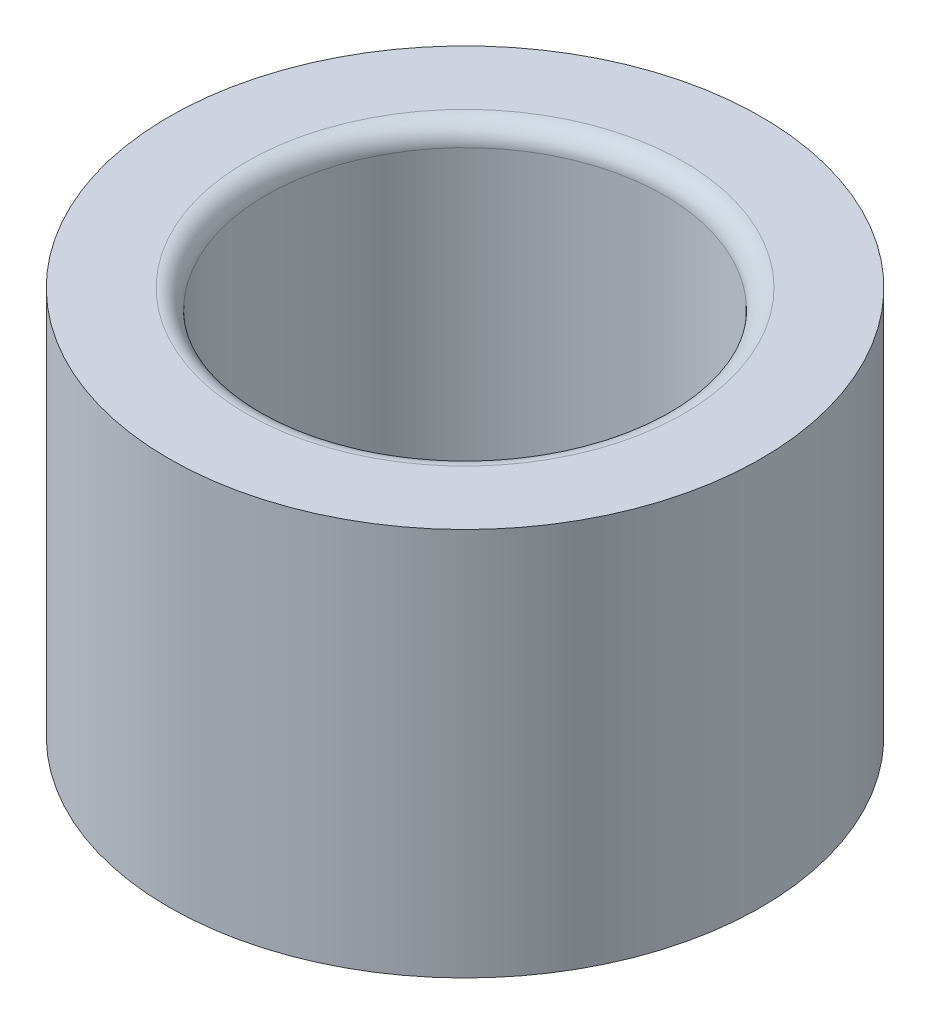
ISO-10303-21;
HEADER;
FILE_DESCRIPTION(('STEP AP214'),'2;1');
FILE_NAME('part.step','',(''),(''),'','','');
FILE_SCHEMA(('AUTOMOTIVE_DESIGN { 1 0 10303 214 1 1 1 1 }'));
ENDSEC;
DATA;
#1=APPLICATION_CONTEXT('core data for automotive mechanical design processes');
#2=APPLICATION_PROTOCOL_DEFINITION('international standard','automotive_design',2000,#1);
#3=PRODUCT_CONTEXT('',#1,'mechanical');
#4=PRODUCT('Part','Part','',(#3));
#5=PRODUCT_RELATED_PRODUCT_CATEGORY('part','',(#4));
#6=PRODUCT_DEFINITION_FORMATION('','',#4);
#7=PRODUCT_DEFINITION_CONTEXT('part definition',#1,'design');
#8=PRODUCT_DEFINITION('design','',#6,#7);
#9=PRODUCT_DEFINITION_SHAPE('','',#8);
#10=(LENGTH_UNIT() NAMED_UNIT(*) SI_UNIT(.MILLI.,.METRE.));
#11=(NAMED_UNIT(*) PLANE_ANGLE_UNIT() SI_UNIT($,.RADIAN.));
#12=(NAMED_UNIT(*) SI_UNIT($,.STERADIAN.) SOLID_ANGLE_UNIT());
#13=UNCERTAINTY_MEASURE_WITH_UNIT(LENGTH_MEASURE(1.E-05),#10,'distance_accuracy_value','');
#14=(GEOMETRIC_REPRESENTATION_CONTEXT(3) GLOBAL_UNCERTAINTY_ASSIGNED_CONTEXT((#13)) GLOBAL_UNIT_ASSIGNED_CONTEXT((#10,
#11,#12)) REPRESENTATION_CONTEXT('',''));
#15=CARTESIAN_POINT('',(0.,0.,0.));
#16=DIRECTION('',(0.,0.,1.));
#17=DIRECTION('',(1.,0.,0.));
#18=AXIS2_PLACEMENT_3D('',#15,#16,#17);
#19=CARTESIAN_POINT('',(0.,20.,0.));
#20=DIRECTION('',(0.,1.,0.));
#21=DIRECTION('',(0.,0.,1.));
#22=AXIS2_PLACEMENT_3D('',#19,#20,#21);
#23=PLANE('',#22);
#24=CARTESIAN_POINT('',(0.,20.,0.));
#25=DIRECTION('',(0.,1.,0.));
#26=DIRECTION('',(0.,0.,1.));
#27=AXIS2_PLACEMENT_3D('',#24,#25,#26);
#28=CIRCLE('',#27,11.25);
#29=CARTESIAN_POINT('',(0.,20.,11.25));
#30=VERTEX_POINT('',#29);
#31=EDGE_CURVE('E10',#30,#30,#28,.F.);
#32=ORIENTED_EDGE('',*,*,#31,.T.);
#33=EDGE_LOOP('',(#32));
#34=FACE_BOUND('',#33,.T.);
#35=CARTESIAN_POINT('',(0.,20.,0.));
#36=DIRECTION('',(0.,1.,0.));
#37=DIRECTION('',(0.,0.,1.));
#38=AXIS2_PLACEMENT_3D('',#35,#36,#37);
#39=CIRCLE('',#38,15.25);
#40=CARTESIAN_POINT('',(0.,20.,15.25));
#41=VERTEX_POINT('',#40);
#42=EDGE_CURVE('E42',#41,#41,#39,.T.);
#43=ORIENTED_EDGE('',*,*,#42,.T.);
#44=EDGE_LOOP('',(#43));
#45=FACE_BOUND('',#44,.T.);
#46=ADVANCED_FACE('F31',(#34,#45),#23,.T.);
#47=CARTESIAN_POINT('',(0.,0.,0.));
#48=DIRECTION('',(0.,1.,0.));
#49=DIRECTION('',(0.,0.,1.));
#50=AXIS2_PLACEMENT_3D('',#47,#48,#49);
#51=PLANE('',#50);
#52=CARTESIAN_POINT('',(0.,0.,0.));
#53=DIRECTION('',(0.,1.,0.));
#54=DIRECTION('',(0.,0.,1.));
#55=AXIS2_PLACEMENT_3D('',#52,#53,#54);
#56=CIRCLE('',#55,15.25);
#57=CARTESIAN_POINT('',(0.,0.,15.25));
#58=VERTEX_POINT('',#57);
#59=EDGE_CURVE('E46',#58,#58,#56,.T.);
#60=ORIENTED_EDGE('',*,*,#59,.F.);
#61=EDGE_LOOP('',(#60));
#62=FACE_BOUND('',#61,.T.);
#63=CARTESIAN_POINT('',(0.,0.,0.));
#64=DIRECTION('',(0.,1.,0.));
#65=DIRECTION('',(0.,0.,1.));
#66=AXIS2_PLACEMENT_3D('',#63,#64,#65);
#67=CIRCLE('',#66,10.25);
#68=CARTESIAN_POINT('',(0.,0.,10.25));
#69=VERTEX_POINT('',#68);
#70=EDGE_CURVE('E50',#69,#69,#67,.T.);
#71=ORIENTED_EDGE('',*,*,#70,.T.);
#72=EDGE_LOOP('',(#71));
#73=FACE_BOUND('',#72,.T.);
#74=ADVANCED_FACE('F55',(#62,#73),#51,.F.);
#75=CARTESIAN_POINT('',(0.,20.,0.));
#76=DIRECTION('',(0.,-1.,0.));
#77=DIRECTION('',(0.,0.,-1.));
#78=AXIS2_PLACEMENT_3D('',#75,#76,#77);
#79=CYLINDRICAL_SURFACE('',#78,15.25);
#80=ORIENTED_EDGE('',*,*,#42,.F.);
#81=EDGE_LOOP('',(#80));
#82=FACE_BOUND('',#81,.T.);
#83=ORIENTED_EDGE('',*,*,#59,.T.);
#84=EDGE_LOOP('',(#83));
#85=FACE_BOUND('',#84,.T.);
#86=ADVANCED_FACE('F59',(#82,#85),#79,.T.);
#87=CARTESIAN_POINT('',(0.,20.,0.));
#88=DIRECTION('',(0.,-1.,0.));
#89=DIRECTION('',(0.,0.,-1.));
#90=AXIS2_PLACEMENT_3D('',#87,#88,#89);
#91=CYLINDRICAL_SURFACE('',#90,10.25);
#92=CARTESIAN_POINT('',(0.,19.,0.));
#93=DIRECTION('',(0.,1.,0.));
#94=DIRECTION('',(0.,0.,1.));
#95=AXIS2_PLACEMENT_3D('',#92,#93,#94);
#96=CIRCLE('',#95,10.25);
#97=CARTESIAN_POINT('',(0.,19.,10.25));
#98=VERTEX_POINT('',#97);
#99=EDGE_CURVE('E38',#98,#98,#96,.T.);
#100=ORIENTED_EDGE('',*,*,#99,.T.);
#101=EDGE_LOOP('',(#100));
#102=FACE_BOUND('',#101,.T.);
#103=ORIENTED_EDGE('',*,*,#70,.F.);
#104=EDGE_LOOP('',(#103));
#105=FACE_BOUND('',#104,.T.);
#106=ADVANCED_FACE('F57',(#102,#105),#91,.F.);
#107=CARTESIAN_POINT('',(0.,19.,0.));
#108=DIRECTION('',(0.,1.,0.));
#109=DIRECTION('',(0.,0.,1.));
#110=AXIS2_PLACEMENT_3D('',#107,#108,#109);
#111=TOROIDAL_SURFACE('',#110,11.25,1.);
#112=ORIENTED_EDGE('',*,*,#31,.F.);
#113=EDGE_LOOP('',(#112));
#114=FACE_BOUND('',#113,.T.);
#115=ORIENTED_EDGE('',*,*,#99,.F.);
#116=EDGE_LOOP('',(#115));
#117=FACE_BOUND('',#116,.T.);
#118=ADVANCED_FACE('F33',(#114,#117),#111,.T.);
#119=CLOSED_SHELL('',(#46,#74,#86,#106,#118));
#120=MANIFOLD_SOLID_BREP('B2',#119);
#121=ADVANCED_BREP_SHAPE_REPRESENTATION('',(#18,#120),#14);
#122=SHAPE_DEFINITION_REPRESENTATION(#9,#121);
ENDSEC;
END-ISO-10303-21;
